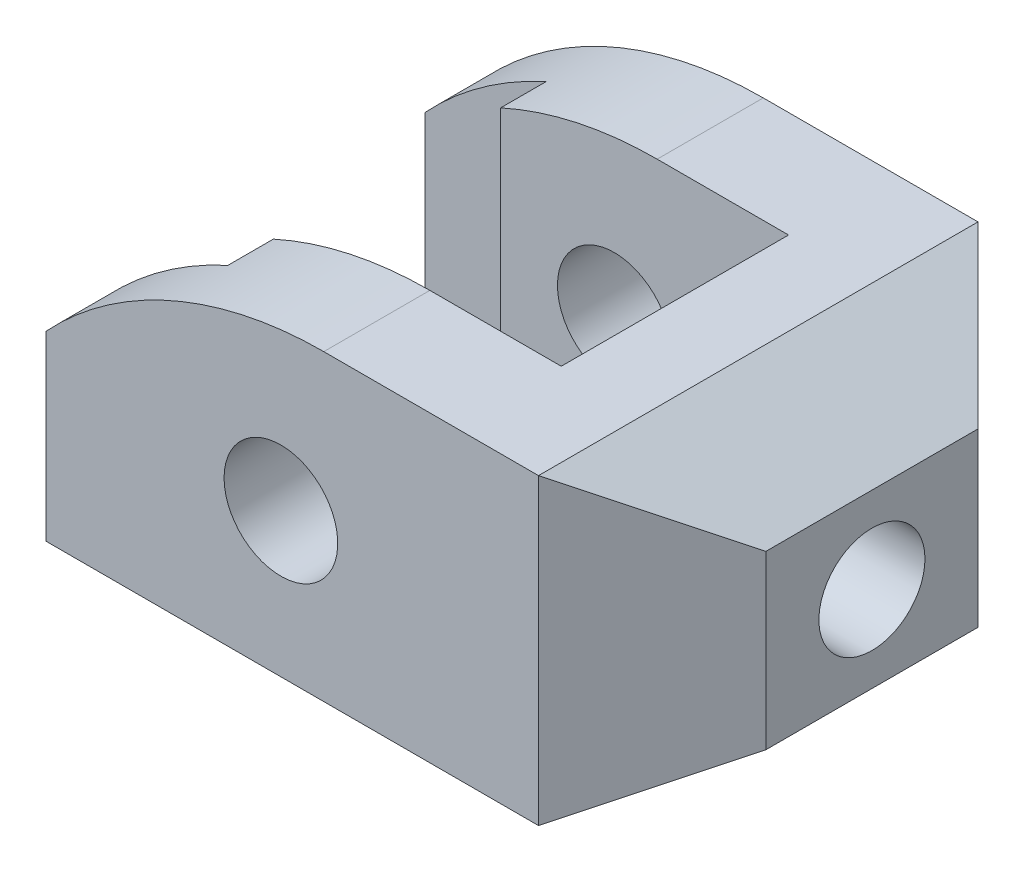
ISO-10303-21;
HEADER;
FILE_DESCRIPTION(('STEP AP214'),'2;1');
FILE_NAME('part.step','',(''),(''),'','','');
FILE_SCHEMA(('AUTOMOTIVE_DESIGN { 1 0 10303 214 1 1 1 1 }'));
ENDSEC;
DATA;
#1=APPLICATION_CONTEXT('core data for automotive mechanical design processes');
#2=APPLICATION_PROTOCOL_DEFINITION('international standard','automotive_design',2000,#1);
#3=PRODUCT_CONTEXT('',#1,'mechanical');
#4=PRODUCT('Part','Part','',(#3));
#5=PRODUCT_RELATED_PRODUCT_CATEGORY('part','',(#4));
#6=PRODUCT_DEFINITION_FORMATION('','',#4);
#7=PRODUCT_DEFINITION_CONTEXT('part definition',#1,'design');
#8=PRODUCT_DEFINITION('design','',#6,#7);
#9=PRODUCT_DEFINITION_SHAPE('','',#8);
#10=(LENGTH_UNIT() NAMED_UNIT(*) SI_UNIT(.MILLI.,.METRE.));
#11=(NAMED_UNIT(*) PLANE_ANGLE_UNIT() SI_UNIT($,.RADIAN.));
#12=(NAMED_UNIT(*) SI_UNIT($,.STERADIAN.) SOLID_ANGLE_UNIT());
#13=UNCERTAINTY_MEASURE_WITH_UNIT(LENGTH_MEASURE(1.E-05),#10,'distance_accuracy_value','');
#14=(GEOMETRIC_REPRESENTATION_CONTEXT(3) GLOBAL_UNCERTAINTY_ASSIGNED_CONTEXT((#13)) GLOBAL_UNIT_ASSIGNED_CONTEXT((#10,
#11,#12)) REPRESENTATION_CONTEXT('',''));
#15=CARTESIAN_POINT('',(0.,0.,0.));
#16=DIRECTION('',(0.,0.,1.));
#17=DIRECTION('',(1.,0.,0.));
#18=AXIS2_PLACEMENT_3D('',#15,#16,#17);
#19=CARTESIAN_POINT('',(36.6606055596467,-10.,58.));
#20=DIRECTION('',(0.,0.,-1.));
#21=DIRECTION('',(-1.,0.,0.));
#22=AXIS2_PLACEMENT_3D('',#19,#20,#21);
#23=CYLINDRICAL_SURFACE('',#22,50.);
#24=DIRECTION('',(0.,0.,-1.));
#25=VECTOR('',#24,1.);
#26=CARTESIAN_POINT('',(0.,24.,58.));
#27=LINE('',#26,#25);
#28=CARTESIAN_POINT('',(0.,24.,8.));
#29=VERTEX_POINT('',#28);
#30=CARTESIAN_POINT('',(0.,24.,0.));
#31=VERTEX_POINT('',#30);
#32=EDGE_CURVE('E226',#29,#31,#27,.T.);
#33=ORIENTED_EDGE('',*,*,#32,.F.);
#34=CARTESIAN_POINT('',(36.6606055596467,-10.,8.));
#35=DIRECTION('',(0.,0.,-1.));
#36=DIRECTION('',(-1.,0.,0.));
#37=AXIS2_PLACEMENT_3D('',#34,#35,#36);
#38=CIRCLE('',#37,50.);
#39=CARTESIAN_POINT('',(16.,35.5317403347236,8.));
#40=VERTEX_POINT('',#39);
#41=EDGE_CURVE('E356',#29,#40,#38,.T.);
#42=ORIENTED_EDGE('',*,*,#41,.T.);
#43=DIRECTION('',(0.,0.,-1.));
#44=VECTOR('',#43,1.);
#45=CARTESIAN_POINT('',(16.,35.5317403347236,58.));
#46=LINE('',#45,#44);
#47=CARTESIAN_POINT('',(16.,35.5317403347236,14.));
#48=VERTEX_POINT('',#47);
#49=EDGE_CURVE('E260',#40,#48,#46,.F.);
#50=ORIENTED_EDGE('',*,*,#49,.T.);
#51=CARTESIAN_POINT('',(36.6606055596467,-10.,14.));
#52=DIRECTION('',(0.,0.,-1.));
#53=DIRECTION('',(-1.,0.,0.));
#54=AXIS2_PLACEMENT_3D('',#51,#52,#53);
#55=CIRCLE('',#54,50.);
#56=CARTESIAN_POINT('',(36.6606055596467,40.,14.));
#57=VERTEX_POINT('',#56);
#58=EDGE_CURVE('E256',#48,#57,#55,.T.);
#59=ORIENTED_EDGE('',*,*,#58,.T.);
#60=DIRECTION('',(0.,0.,-1.));
#61=VECTOR('',#60,1.);
#62=CARTESIAN_POINT('',(36.6606055596467,40.,58.));
#63=LINE('',#62,#61);
#64=CARTESIAN_POINT('',(36.6606055596467,40.,0.));
#65=VERTEX_POINT('',#64);
#66=EDGE_CURVE('E231',#57,#65,#63,.T.);
#67=ORIENTED_EDGE('',*,*,#66,.T.);
#68=CARTESIAN_POINT('',(36.6606055596467,-10.,0.));
#69=DIRECTION('',(0.,0.,1.));
#70=DIRECTION('',(1.,0.,0.));
#71=AXIS2_PLACEMENT_3D('',#68,#69,#70);
#72=CIRCLE('',#71,50.);
#73=EDGE_CURVE('E206',#65,#31,#72,.T.);
#74=ORIENTED_EDGE('',*,*,#73,.T.);
#75=EDGE_LOOP('',(#33,#42,#50,#59,#67,#74));
#76=FACE_BOUND('',#75,.T.);
#77=ADVANCED_FACE('F43',(#76),#23,.T.);
#78=CARTESIAN_POINT('',(0.,0.,58.));
#79=DIRECTION('',(1.,0.,0.));
#80=DIRECTION('',(0.,0.,-1.));
#81=AXIS2_PLACEMENT_3D('',#78,#79,#80);
#82=PLANE('',#81);
#83=DIRECTION('',(0.,0.,-1.));
#84=VECTOR('',#83,1.);
#85=CARTESIAN_POINT('',(0.,0.,58.));
#86=LINE('',#85,#84);
#87=CARTESIAN_POINT('',(0.,0.,8.));
#88=VERTEX_POINT('',#87);
#89=CARTESIAN_POINT('',(0.,0.,0.));
#90=VERTEX_POINT('',#89);
#91=EDGE_CURVE('E199',#88,#90,#86,.T.);
#92=ORIENTED_EDGE('',*,*,#91,.F.);
#93=DIRECTION('',(0.,1.,0.));
#94=VECTOR('',#93,1.);
#95=CARTESIAN_POINT('',(0.,0.,8.));
#96=LINE('',#95,#94);
#97=EDGE_CURVE('E251',#88,#29,#96,.T.);
#98=ORIENTED_EDGE('',*,*,#97,.T.);
#99=ORIENTED_EDGE('',*,*,#32,.T.);
#100=DIRECTION('',(0.,-1.,0.));
#101=VECTOR('',#100,1.);
#102=CARTESIAN_POINT('',(0.,0.,0.));
#103=LINE('',#102,#101);
#104=EDGE_CURVE('E218',#31,#90,#103,.T.);
#105=ORIENTED_EDGE('',*,*,#104,.T.);
#106=EDGE_LOOP('',(#92,#98,#99,#105));
#107=FACE_BOUND('',#106,.T.);
#108=ADVANCED_FACE('F385',(#107),#82,.F.);
#109=CARTESIAN_POINT('',(31.,19.,58.));
#110=DIRECTION('',(0.,0.,-1.));
#111=DIRECTION('',(-1.,0.,0.));
#112=AXIS2_PLACEMENT_3D('',#109,#110,#111);
#113=CYLINDRICAL_SURFACE('',#112,7.5);
#114=CARTESIAN_POINT('',(31.,19.,14.));
#115=DIRECTION('',(0.,0.,-1.));
#116=DIRECTION('',(-1.,0.,0.));
#117=AXIS2_PLACEMENT_3D('',#114,#115,#116);
#118=CIRCLE('',#117,7.5);
#119=CARTESIAN_POINT('',(23.5,19.,14.));
#120=VERTEX_POINT('',#119);
#121=EDGE_CURVE('E252',#120,#120,#118,.T.);
#122=CARTESIAN_POINT('',(31.,19.,0.));
#123=DIRECTION('',(0.,0.,1.));
#124=DIRECTION('',(1.,0.,0.));
#125=AXIS2_PLACEMENT_3D('',#122,#123,#124);
#126=CIRCLE('',#125,7.5);
#127=CARTESIAN_POINT('',(23.5,19.,0.));
#128=VERTEX_POINT('',#127);
#129=EDGE_CURVE('E209',#128,#128,#126,.T.);
#130=CARTESIAN_POINT('',(23.5,19.,14.));
#131=CARTESIAN_POINT('',(23.5,19.,13.8541666666667));
#132=CARTESIAN_POINT('',(23.5,19.,13.7083333333333));
#133=CARTESIAN_POINT('',(23.5,19.,13.4166666666667));
#134=CARTESIAN_POINT('',(23.5,19.,13.2708333333333));
#135=CARTESIAN_POINT('',(23.5,19.,12.9791666666667));
#136=CARTESIAN_POINT('',(23.5,19.,12.8333333333333));
#137=CARTESIAN_POINT('',(23.5,19.,12.5416666666667));
#138=CARTESIAN_POINT('',(23.5,19.,12.3958333333333));
#139=CARTESIAN_POINT('',(23.5,19.,12.1041666666667));
#140=CARTESIAN_POINT('',(23.5,19.,11.9583333333333));
#141=CARTESIAN_POINT('',(23.5,19.,11.6666666666667));
#142=CARTESIAN_POINT('',(23.5,19.,11.5208333333333));
#143=CARTESIAN_POINT('',(23.5,19.,11.2291666666667));
#144=CARTESIAN_POINT('',(23.5,19.,11.0833333333333));
#145=CARTESIAN_POINT('',(23.5,19.,10.7916666666667));
#146=CARTESIAN_POINT('',(23.5,19.,10.6458333333333));
#147=CARTESIAN_POINT('',(23.5,19.,10.3541666666667));
#148=CARTESIAN_POINT('',(23.5,19.,10.2083333333333));
#149=CARTESIAN_POINT('',(23.5,19.,9.91666666666667));
#150=CARTESIAN_POINT('',(23.5,19.,9.77083333333333));
#151=CARTESIAN_POINT('',(23.5,19.,9.47916666666667));
#152=CARTESIAN_POINT('',(23.5,19.,9.33333333333333));
#153=CARTESIAN_POINT('',(23.5,19.,9.04166666666667));
#154=CARTESIAN_POINT('',(23.5,19.,8.89583333333333));
#155=CARTESIAN_POINT('',(23.5,19.,8.60416666666667));
#156=CARTESIAN_POINT('',(23.5,19.,8.45833333333333));
#157=CARTESIAN_POINT('',(23.5,19.,8.16666666666667));
#158=CARTESIAN_POINT('',(23.5,19.,8.02083333333333));
#159=CARTESIAN_POINT('',(23.5,19.,7.72916666666667));
#160=CARTESIAN_POINT('',(23.5,19.,7.58333333333333));
#161=CARTESIAN_POINT('',(23.5,19.,7.29166666666667));
#162=CARTESIAN_POINT('',(23.5,19.,7.14583333333333));
#163=CARTESIAN_POINT('',(23.5,19.,6.85416666666667));
#164=CARTESIAN_POINT('',(23.5,19.,6.70833333333333));
#165=CARTESIAN_POINT('',(23.5,19.,6.41666666666667));
#166=CARTESIAN_POINT('',(23.5,19.,6.27083333333333));
#167=CARTESIAN_POINT('',(23.5,19.,5.97916666666667));
#168=CARTESIAN_POINT('',(23.5,19.,5.83333333333333));
#169=CARTESIAN_POINT('',(23.5,19.,5.54166666666666));
#170=CARTESIAN_POINT('',(23.5,19.,5.39583333333333));
#171=CARTESIAN_POINT('',(23.5,19.,5.10416666666666));
#172=CARTESIAN_POINT('',(23.5,19.,4.95833333333333));
#173=CARTESIAN_POINT('',(23.5,19.,4.66666666666667));
#174=CARTESIAN_POINT('',(23.5,19.,4.52083333333333));
#175=CARTESIAN_POINT('',(23.5,19.,4.22916666666667));
#176=CARTESIAN_POINT('',(23.5,19.,4.08333333333333));
#177=CARTESIAN_POINT('',(23.5,19.,3.79166666666667));
#178=CARTESIAN_POINT('',(23.5,19.,3.64583333333333));
#179=CARTESIAN_POINT('',(23.5,19.,3.35416666666667));
#180=CARTESIAN_POINT('',(23.5,19.,3.20833333333333));
#181=CARTESIAN_POINT('',(23.5,19.,2.91666666666666));
#182=CARTESIAN_POINT('',(23.5,19.,2.77083333333333));
#183=CARTESIAN_POINT('',(23.5,19.,2.47916666666667));
#184=CARTESIAN_POINT('',(23.5,19.,2.33333333333334));
#185=CARTESIAN_POINT('',(23.5,19.,2.04166666666667));
#186=CARTESIAN_POINT('',(23.5,19.,1.89583333333333));
#187=CARTESIAN_POINT('',(23.5,19.,1.60416666666667));
#188=CARTESIAN_POINT('',(23.5,19.,1.45833333333333));
#189=CARTESIAN_POINT('',(23.5,19.,1.16666666666667));
#190=CARTESIAN_POINT('',(23.5,19.,1.02083333333333));
#191=CARTESIAN_POINT('',(23.5,19.,0.729166666666667));
#192=CARTESIAN_POINT('',(23.5,19.,0.583333333333334));
#193=CARTESIAN_POINT('',(23.5,19.,0.291666666666667));
#194=CARTESIAN_POINT('',(23.5,19.,0.145833333333333));
#195=CARTESIAN_POINT('',(23.5,19.,0.));
#196=B_SPLINE_CURVE_WITH_KNOTS('',3,(#130,#131,#132,#133,#134,#135,#136,#137,#138,#139,#140,
#141,#142,#143,#144,#145,#146,#147,#148,#149,#150,#151,#152,#153,#154,#155,#156,#157,#158,#159,
#160,#161,#162,#163,#164,#165,#166,#167,#168,#169,#170,#171,#172,#173,#174,#175,#176,#177,#178,
#179,#180,#181,#182,#183,#184,#185,#186,#187,#188,#189,#190,#191,#192,#193,#194,#195),
.UNSPECIFIED.,.F.,.F.,(4,2,2,2,2,2,2,2,2,2,2,2,2,2,2,2,2,2,2,2,2,2,2,2,2,2,2,2,2,2,2,2,4),(0.,
0.4375,0.875000000000001,1.3125,1.75,2.1875,2.625,3.0625,3.5,3.9375,4.375,4.8125,5.25,5.6875,
6.125,6.5625,7.,7.4375,7.875,8.3125,8.75,9.1875,9.62499999999999,10.0625,10.5,10.9375,11.375,
11.8125,12.25,12.6875,13.125,13.5625,14.),.UNSPECIFIED.);
#197=EDGE_CURVE('BSEAM425',#120,#128,#196,.T.);
#198=ORIENTED_EDGE('',*,*,#121,.F.);
#199=ORIENTED_EDGE('',*,*,#129,.F.);
#200=ORIENTED_EDGE('',*,*,#197,.T.);
#201=ORIENTED_EDGE('',*,*,#197,.F.);
#202=EDGE_LOOP('',(#198,#200,#199,#201));
#203=FACE_BOUND('',#202,.T.);
#204=ADVANCED_FACE('F425',(#203),#113,.F.);
#205=CARTESIAN_POINT('',(36.6606055596467,-10.,58.));
#206=DIRECTION('',(0.,0.,1.));
#207=DIRECTION('',(1.,0.,0.));
#208=AXIS2_PLACEMENT_3D('',#205,#206,#207);
#209=PLANE('',#208);
#210=DIRECTION('',(0.,1.,0.));
#211=VECTOR('',#210,1.);
#212=CARTESIAN_POINT('',(65.,0.,58.));
#213=LINE('',#212,#211);
#214=CARTESIAN_POINT('',(65.,0.,58.));
#215=VERTEX_POINT('',#214);
#216=CARTESIAN_POINT('',(65.,40.,58.));
#217=VERTEX_POINT('',#216);
#218=EDGE_CURVE('E183',#215,#217,#213,.T.);
#219=ORIENTED_EDGE('',*,*,#218,.T.);
#220=DIRECTION('',(-1.,0.,0.));
#221=VECTOR('',#220,1.);
#222=CARTESIAN_POINT('',(65.,40.,58.));
#223=LINE('',#222,#221);
#224=CARTESIAN_POINT('',(36.6606055596467,40.,58.));
#225=VERTEX_POINT('',#224);
#226=EDGE_CURVE('E365',#217,#225,#223,.T.);
#227=ORIENTED_EDGE('',*,*,#226,.T.);
#228=CARTESIAN_POINT('',(36.6606055596467,-10.,58.));
#229=DIRECTION('',(0.,0.,1.));
#230=DIRECTION('',(1.,0.,0.));
#231=AXIS2_PLACEMENT_3D('',#228,#229,#230);
#232=CIRCLE('',#231,50.);
#233=CARTESIAN_POINT('',(0.,24.,58.));
#234=VERTEX_POINT('',#233);
#235=EDGE_CURVE('E367',#225,#234,#232,.T.);
#236=ORIENTED_EDGE('',*,*,#235,.T.);
#237=DIRECTION('',(0.,-1.,0.));
#238=VECTOR('',#237,1.);
#239=CARTESIAN_POINT('',(0.,0.,58.));
#240=LINE('',#239,#238);
#241=CARTESIAN_POINT('',(0.,0.,58.));
#242=VERTEX_POINT('',#241);
#243=EDGE_CURVE('E212',#234,#242,#240,.T.);
#244=ORIENTED_EDGE('',*,*,#243,.T.);
#245=DIRECTION('',(1.,0.,0.));
#246=VECTOR('',#245,1.);
#247=CARTESIAN_POINT('',(0.,0.,58.));
#248=LINE('',#247,#246);
#249=EDGE_CURVE('E221',#242,#215,#248,.T.);
#250=ORIENTED_EDGE('',*,*,#249,.T.);
#251=EDGE_LOOP('',(#219,#227,#236,#244,#250));
#252=FACE_BOUND('',#251,.T.);
#253=CARTESIAN_POINT('',(31.,19.,58.));
#254=DIRECTION('',(0.,0.,1.));
#255=DIRECTION('',(1.,0.,0.));
#256=AXIS2_PLACEMENT_3D('',#253,#254,#255);
#257=CIRCLE('',#256,7.5);
#258=CARTESIAN_POINT('',(23.5,19.,58.));
#259=VERTEX_POINT('',#258);
#260=EDGE_CURVE('E202',#259,#259,#257,.T.);
#261=ORIENTED_EDGE('',*,*,#260,.F.);
#262=EDGE_LOOP('',(#261));
#263=FACE_BOUND('',#262,.T.);
#264=ADVANCED_FACE('F406',(#252,#263),#209,.T.);
#265=CARTESIAN_POINT('',(36.6606055596467,-10.,0.));
#266=DIRECTION('',(0.,0.,1.));
#267=DIRECTION('',(1.,0.,0.));
#268=AXIS2_PLACEMENT_3D('',#265,#266,#267);
#269=PLANE('',#268);
#270=DIRECTION('',(-1.,0.,0.));
#271=VECTOR('',#270,1.);
#272=CARTESIAN_POINT('',(65.,40.,0.));
#273=LINE('',#272,#271);
#274=CARTESIAN_POINT('',(65.,40.,0.));
#275=VERTEX_POINT('',#274);
#276=EDGE_CURVE('E181',#275,#65,#273,.T.);
#277=ORIENTED_EDGE('',*,*,#276,.F.);
#278=DIRECTION('',(0.,1.,0.));
#279=VECTOR('',#278,1.);
#280=CARTESIAN_POINT('',(65.,0.,0.));
#281=LINE('',#280,#279);
#282=CARTESIAN_POINT('',(65.,0.,0.));
#283=VERTEX_POINT('',#282);
#284=EDGE_CURVE('E160',#283,#275,#281,.T.);
#285=ORIENTED_EDGE('',*,*,#284,.F.);
#286=DIRECTION('',(1.,0.,0.));
#287=VECTOR('',#286,1.);
#288=CARTESIAN_POINT('',(0.,0.,0.));
#289=LINE('',#288,#287);
#290=EDGE_CURVE('E178',#90,#283,#289,.T.);
#291=ORIENTED_EDGE('',*,*,#290,.F.);
#292=ORIENTED_EDGE('',*,*,#104,.F.);
#293=ORIENTED_EDGE('',*,*,#73,.F.);
#294=EDGE_LOOP('',(#277,#285,#291,#292,#293));
#295=FACE_BOUND('',#294,.T.);
#296=ORIENTED_EDGE('',*,*,#129,.T.);
#297=EDGE_LOOP('',(#296));
#298=FACE_BOUND('',#297,.T.);
#299=ADVANCED_FACE('F174',(#295,#298),#269,.F.);
#300=CARTESIAN_POINT('',(0.,0.,58.));
#301=DIRECTION('',(0.,1.,0.));
#302=DIRECTION('',(0.,0.,1.));
#303=AXIS2_PLACEMENT_3D('',#300,#301,#302);
#304=PLANE('',#303);
#305=DIRECTION('',(0.,0.,-1.));
#306=VECTOR('',#305,1.);
#307=CARTESIAN_POINT('',(16.,0.,8.));
#308=LINE('',#307,#306);
#309=CARTESIAN_POINT('',(16.,0.,14.));
#310=VERTEX_POINT('',#309);
#311=CARTESIAN_POINT('',(16.,0.,8.));
#312=VERTEX_POINT('',#311);
#313=EDGE_CURVE('E303',#310,#312,#308,.T.);
#314=ORIENTED_EDGE('',*,*,#313,.T.);
#315=DIRECTION('',(-1.,0.,0.));
#316=VECTOR('',#315,1.);
#317=CARTESIAN_POINT('',(0.,0.,8.));
#318=LINE('',#317,#316);
#319=EDGE_CURVE('E306',#312,#88,#318,.T.);
#320=ORIENTED_EDGE('',*,*,#319,.T.);
#321=ORIENTED_EDGE('',*,*,#91,.T.);
#322=ORIENTED_EDGE('',*,*,#290,.T.);
#323=DIRECTION('',(0.,0.,-1.));
#324=VECTOR('',#323,1.);
#325=CARTESIAN_POINT('',(65.,0.,58.));
#326=LINE('',#325,#324);
#327=EDGE_CURVE('E187',#215,#283,#326,.T.);
#328=ORIENTED_EDGE('',*,*,#327,.F.);
#329=ORIENTED_EDGE('',*,*,#249,.F.);
#330=CARTESIAN_POINT('',(0.,0.,50.));
#331=VERTEX_POINT('',#330);
#332=EDGE_CURVE('E222',#242,#331,#86,.T.);
#333=ORIENTED_EDGE('',*,*,#332,.T.);
#334=DIRECTION('',(1.,0.,0.));
#335=VECTOR('',#334,1.);
#336=CARTESIAN_POINT('',(0.,0.,50.));
#337=LINE('',#336,#335);
#338=CARTESIAN_POINT('',(16.,0.,50.));
#339=VERTEX_POINT('',#338);
#340=EDGE_CURVE('E68',#331,#339,#337,.T.);
#341=ORIENTED_EDGE('',*,*,#340,.T.);
#342=DIRECTION('',(0.,0.,-1.));
#343=VECTOR('',#342,1.);
#344=CARTESIAN_POINT('',(16.,0.,44.));
#345=LINE('',#344,#343);
#346=CARTESIAN_POINT('',(16.,0.,44.));
#347=VERTEX_POINT('',#346);
#348=EDGE_CURVE('E286',#339,#347,#345,.T.);
#349=ORIENTED_EDGE('',*,*,#348,.T.);
#350=DIRECTION('',(1.,0.,0.));
#351=VECTOR('',#350,1.);
#352=CARTESIAN_POINT('',(16.,0.,44.));
#353=LINE('',#352,#351);
#354=CARTESIAN_POINT('',(54.,0.,44.));
#355=VERTEX_POINT('',#354);
#356=EDGE_CURVE('E291',#347,#355,#353,.T.);
#357=ORIENTED_EDGE('',*,*,#356,.T.);
#358=DIRECTION('',(0.,0.,-1.));
#359=VECTOR('',#358,1.);
#360=CARTESIAN_POINT('',(54.,0.,14.));
#361=LINE('',#360,#359);
#362=CARTESIAN_POINT('',(54.,0.,14.));
#363=VERTEX_POINT('',#362);
#364=EDGE_CURVE('E295',#355,#363,#361,.T.);
#365=ORIENTED_EDGE('',*,*,#364,.T.);
#366=DIRECTION('',(-1.,0.,0.));
#367=VECTOR('',#366,1.);
#368=CARTESIAN_POINT('',(16.,0.,14.));
#369=LINE('',#368,#367);
#370=EDGE_CURVE('E299',#363,#310,#369,.T.);
#371=ORIENTED_EDGE('',*,*,#370,.T.);
#372=EDGE_LOOP('',(#314,#320,#321,#322,#328,#329,#333,#341,#349,#357,#365,#371));
#373=FACE_BOUND('',#372,.T.);
#374=ADVANCED_FACE('F45',(#373),#304,.F.);
#375=CARTESIAN_POINT('',(65.,0.,58.));
#376=DIRECTION('',(-0.500000000000001,0.866025403784438,0.));
#377=DIRECTION('',(-0.866025403784438,-0.500000000000001,0.));
#378=AXIS2_PLACEMENT_3D('',#375,#376,#377);
#379=PLANE('',#378);
#380=ORIENTED_EDGE('',*,*,#327,.T.);
#381=DIRECTION('',(0.65465367070798,0.37796447300923,0.654653670707973));
#382=VECTOR('',#381,1.);
#383=CARTESIAN_POINT('',(89.8571428571428,14.3512781198564,24.8571428571425));
#384=LINE('',#383,#382);
#385=CARTESIAN_POINT('',(80.,8.66025403784441,14.9999999999998));
#386=VERTEX_POINT('',#385);
#387=EDGE_CURVE('E157',#283,#386,#384,.T.);
#388=ORIENTED_EDGE('',*,*,#387,.T.);
#389=DIRECTION('',(0.,0.,-1.));
#390=VECTOR('',#389,1.);
#391=CARTESIAN_POINT('',(80.,8.66025403784441,58.));
#392=LINE('',#391,#390);
#393=CARTESIAN_POINT('',(80.,8.66025403784441,43.0000000000002));
#394=VERTEX_POINT('',#393);
#395=EDGE_CURVE('E194',#394,#386,#392,.T.);
#396=ORIENTED_EDGE('',*,*,#395,.F.);
#397=DIRECTION('',(-0.65465367070798,-0.37796447300923,0.654653670707973));
#398=VECTOR('',#397,1.);
#399=CARTESIAN_POINT('',(65.,0.,58.));
#400=LINE('',#399,#398);
#401=EDGE_CURVE('E169',#394,#215,#400,.T.);
#402=ORIENTED_EDGE('',*,*,#401,.T.);
#403=EDGE_LOOP('',(#380,#388,#396,#402));
#404=FACE_BOUND('',#403,.T.);
#405=ADVANCED_FACE('F188',(#404),#379,.F.);
#406=CARTESIAN_POINT('',(80.,8.66025403784441,58.));
#407=DIRECTION('',(-1.,0.,0.));
#408=DIRECTION('',(0.,0.,1.));
#409=AXIS2_PLACEMENT_3D('',#406,#407,#408);
#410=PLANE('',#409);
#411=CARTESIAN_POINT('',(80.,20.,29.));
#412=DIRECTION('',(1.,0.,0.));
#413=DIRECTION('',(0.,0.,-1.));
#414=AXIS2_PLACEMENT_3D('',#411,#412,#413);
#415=CIRCLE('',#414,7.);
#416=CARTESIAN_POINT('',(80.,20.,22.));
#417=VERTEX_POINT('',#416);
#418=EDGE_CURVE('E278',#417,#417,#415,.T.);
#419=ORIENTED_EDGE('',*,*,#418,.F.);
#420=EDGE_LOOP('',(#419));
#421=FACE_BOUND('',#420,.T.);
#422=ORIENTED_EDGE('',*,*,#395,.T.);
#423=DIRECTION('',(0.,1.,0.));
#424=VECTOR('',#423,1.);
#425=CARTESIAN_POINT('',(80.,0.,14.9999999999998));
#426=LINE('',#425,#424);
#427=CARTESIAN_POINT('',(80.,31.3397459621556,14.9999999999998));
#428=VERTEX_POINT('',#427);
#429=EDGE_CURVE('E162',#386,#428,#426,.T.);
#430=ORIENTED_EDGE('',*,*,#429,.T.);
#431=DIRECTION('',(0.,0.,-1.));
#432=VECTOR('',#431,1.);
#433=CARTESIAN_POINT('',(80.,31.3397459621556,58.));
#434=LINE('',#433,#432);
#435=CARTESIAN_POINT('',(80.,31.3397459621556,43.0000000000002));
#436=VERTEX_POINT('',#435);
#437=EDGE_CURVE('E240',#436,#428,#434,.T.);
#438=ORIENTED_EDGE('',*,*,#437,.F.);
#439=DIRECTION('',(0.,1.,0.));
#440=VECTOR('',#439,1.);
#441=CARTESIAN_POINT('',(80.,0.,43.0000000000002));
#442=LINE('',#441,#440);
#443=EDGE_CURVE('E60',#394,#436,#442,.T.);
#444=ORIENTED_EDGE('',*,*,#443,.F.);
#445=EDGE_LOOP('',(#422,#430,#438,#444));
#446=FACE_BOUND('',#445,.T.);
#447=ADVANCED_FACE('F272',(#421,#446),#410,.F.);
#448=CARTESIAN_POINT('',(80.,31.3397459621556,58.));
#449=DIRECTION('',(-0.500000000000001,-0.866025403784438,0.));
#450=DIRECTION('',(0.866025403784438,-0.500000000000001,0.));
#451=AXIS2_PLACEMENT_3D('',#448,#449,#450);
#452=PLANE('',#451);
#453=ORIENTED_EDGE('',*,*,#437,.T.);
#454=DIRECTION('',(-0.65465367070798,0.37796447300923,-0.654653670707973));
#455=VECTOR('',#454,1.);
#456=CARTESIAN_POINT('',(98.4285714285715,20.7000052870896,33.4285714285711));
#457=LINE('',#456,#455);
#458=EDGE_CURVE('E11',#428,#275,#457,.T.);
#459=ORIENTED_EDGE('',*,*,#458,.T.);
#460=DIRECTION('',(0.,0.,-1.));
#461=VECTOR('',#460,1.);
#462=CARTESIAN_POINT('',(65.,40.,58.));
#463=LINE('',#462,#461);
#464=EDGE_CURVE('E236',#217,#275,#463,.T.);
#465=ORIENTED_EDGE('',*,*,#464,.F.);
#466=DIRECTION('',(0.65465367070798,-0.37796447300923,-0.654653670707973));
#467=VECTOR('',#466,1.);
#468=CARTESIAN_POINT('',(73.5714285714287,35.051283406946,49.4285714285714));
#469=LINE('',#468,#467);
#470=EDGE_CURVE('E53',#217,#436,#469,.T.);
#471=ORIENTED_EDGE('',*,*,#470,.T.);
#472=EDGE_LOOP('',(#453,#459,#465,#471));
#473=FACE_BOUND('',#472,.T.);
#474=ADVANCED_FACE('F268',(#473),#452,.F.);
#475=CARTESIAN_POINT('',(65.,40.,58.));
#476=DIRECTION('',(0.,-1.,0.));
#477=DIRECTION('',(1.,0.,0.));
#478=AXIS2_PLACEMENT_3D('',#475,#476,#477);
#479=PLANE('',#478);
#480=ORIENTED_EDGE('',*,*,#66,.F.);
#481=DIRECTION('',(-1.,0.,0.));
#482=VECTOR('',#481,1.);
#483=CARTESIAN_POINT('',(16.,40.,14.));
#484=LINE('',#483,#482);
#485=CARTESIAN_POINT('',(54.,40.,14.));
#486=VERTEX_POINT('',#485);
#487=EDGE_CURVE('E287',#486,#57,#484,.T.);
#488=ORIENTED_EDGE('',*,*,#487,.F.);
#489=DIRECTION('',(0.,0.,-1.));
#490=VECTOR('',#489,1.);
#491=CARTESIAN_POINT('',(54.,40.,14.));
#492=LINE('',#491,#490);
#493=CARTESIAN_POINT('',(54.,40.,44.));
#494=VERTEX_POINT('',#493);
#495=EDGE_CURVE('E312',#494,#486,#492,.T.);
#496=ORIENTED_EDGE('',*,*,#495,.F.);
#497=DIRECTION('',(1.,0.,0.));
#498=VECTOR('',#497,1.);
#499=CARTESIAN_POINT('',(16.,40.,44.));
#500=LINE('',#499,#498);
#501=CARTESIAN_POINT('',(36.6606055596467,40.,44.));
#502=VERTEX_POINT('',#501);
#503=EDGE_CURVE('E168',#502,#494,#500,.T.);
#504=ORIENTED_EDGE('',*,*,#503,.F.);
#505=EDGE_CURVE('E232',#225,#502,#63,.T.);
#506=ORIENTED_EDGE('',*,*,#505,.F.);
#507=ORIENTED_EDGE('',*,*,#226,.F.);
#508=ORIENTED_EDGE('',*,*,#464,.T.);
#509=ORIENTED_EDGE('',*,*,#276,.T.);
#510=EDGE_LOOP('',(#480,#488,#496,#504,#506,#507,#508,#509));
#511=FACE_BOUND('',#510,.T.);
#512=ADVANCED_FACE('F383',(#511),#479,.F.);
#513=ORIENTED_EDGE('',*,*,#505,.T.);
#514=CARTESIAN_POINT('',(36.6606055596467,-10.,44.));
#515=DIRECTION('',(0.,0.,1.));
#516=DIRECTION('',(1.,0.,0.));
#517=AXIS2_PLACEMENT_3D('',#514,#515,#516);
#518=CIRCLE('',#517,50.);
#519=CARTESIAN_POINT('',(16.,35.5317403347236,44.));
#520=VERTEX_POINT('',#519);
#521=EDGE_CURVE('E250',#502,#520,#518,.T.);
#522=ORIENTED_EDGE('',*,*,#521,.T.);
#523=DIRECTION('',(0.,0.,-1.));
#524=VECTOR('',#523,1.);
#525=CARTESIAN_POINT('',(16.,35.5317403347236,58.));
#526=LINE('',#525,#524);
#527=CARTESIAN_POINT('',(16.,35.5317403347236,50.));
#528=VERTEX_POINT('',#527);
#529=EDGE_CURVE('E193',#520,#528,#526,.F.);
#530=ORIENTED_EDGE('',*,*,#529,.T.);
#531=CARTESIAN_POINT('',(36.6606055596467,-10.,50.));
#532=DIRECTION('',(0.,0.,1.));
#533=DIRECTION('',(1.,0.,0.));
#534=AXIS2_PLACEMENT_3D('',#531,#532,#533);
#535=CIRCLE('',#534,50.);
#536=CARTESIAN_POINT('',(0.,24.,50.));
#537=VERTEX_POINT('',#536);
#538=EDGE_CURVE('E352',#528,#537,#535,.T.);
#539=ORIENTED_EDGE('',*,*,#538,.T.);
#540=EDGE_CURVE('E227',#234,#537,#27,.T.);
#541=ORIENTED_EDGE('',*,*,#540,.F.);
#542=ORIENTED_EDGE('',*,*,#235,.F.);
#543=EDGE_LOOP('',(#513,#522,#530,#539,#541,#542));
#544=FACE_BOUND('',#543,.T.);
#545=ADVANCED_FACE('F405',(#544),#23,.T.);
#546=ORIENTED_EDGE('',*,*,#540,.T.);
#547=DIRECTION('',(0.,1.,0.));
#548=VECTOR('',#547,1.);
#549=CARTESIAN_POINT('',(0.,0.,50.));
#550=LINE('',#549,#548);
#551=EDGE_CURVE('E309',#331,#537,#550,.T.);
#552=ORIENTED_EDGE('',*,*,#551,.F.);
#553=ORIENTED_EDGE('',*,*,#332,.F.);
#554=ORIENTED_EDGE('',*,*,#243,.F.);
#555=EDGE_LOOP('',(#546,#552,#553,#554));
#556=FACE_BOUND('',#555,.T.);
#557=ADVANCED_FACE('F427',(#556),#82,.F.);
#558=CARTESIAN_POINT('',(31.,19.,44.));
#559=DIRECTION('',(0.,0.,1.));
#560=DIRECTION('',(1.,0.,0.));
#561=AXIS2_PLACEMENT_3D('',#558,#559,#560);
#562=CIRCLE('',#561,7.5);
#563=CARTESIAN_POINT('',(23.5,19.,44.));
#564=VERTEX_POINT('',#563);
#565=EDGE_CURVE('E246',#564,#564,#562,.T.);
#566=CARTESIAN_POINT('',(23.5,19.,44.));
#567=CARTESIAN_POINT('',(23.5,19.,44.1458333333333));
#568=CARTESIAN_POINT('',(23.5,19.,44.2916666666667));
#569=CARTESIAN_POINT('',(23.5,19.,44.5833333333333));
#570=CARTESIAN_POINT('',(23.5,19.,44.7291666666667));
#571=CARTESIAN_POINT('',(23.5,19.,45.0208333333333));
#572=CARTESIAN_POINT('',(23.5,19.,45.1666666666667));
#573=CARTESIAN_POINT('',(23.5,19.,45.4583333333333));
#574=CARTESIAN_POINT('',(23.5,19.,45.6041666666667));
#575=CARTESIAN_POINT('',(23.5,19.,45.8958333333333));
#576=CARTESIAN_POINT('',(23.5,19.,46.0416666666667));
#577=CARTESIAN_POINT('',(23.5,19.,46.3333333333333));
#578=CARTESIAN_POINT('',(23.5,19.,46.4791666666667));
#579=CARTESIAN_POINT('',(23.5,19.,46.7708333333333));
#580=CARTESIAN_POINT('',(23.5,19.,46.9166666666667));
#581=CARTESIAN_POINT('',(23.5,19.,47.2083333333333));
#582=CARTESIAN_POINT('',(23.5,19.,47.3541666666667));
#583=CARTESIAN_POINT('',(23.5,19.,47.6458333333333));
#584=CARTESIAN_POINT('',(23.5,19.,47.7916666666667));
#585=CARTESIAN_POINT('',(23.5,19.,48.0833333333333));
#586=CARTESIAN_POINT('',(23.5,19.,48.2291666666667));
#587=CARTESIAN_POINT('',(23.5,19.,48.5208333333333));
#588=CARTESIAN_POINT('',(23.5,19.,48.6666666666667));
#589=CARTESIAN_POINT('',(23.5,19.,48.9583333333333));
#590=CARTESIAN_POINT('',(23.5,19.,49.1041666666667));
#591=CARTESIAN_POINT('',(23.5,19.,49.3958333333333));
#592=CARTESIAN_POINT('',(23.5,19.,49.5416666666667));
#593=CARTESIAN_POINT('',(23.5,19.,49.8333333333333));
#594=CARTESIAN_POINT('',(23.5,19.,49.9791666666667));
#595=CARTESIAN_POINT('',(23.5,19.,50.2708333333333));
#596=CARTESIAN_POINT('',(23.5,19.,50.4166666666667));
#597=CARTESIAN_POINT('',(23.5,19.,50.7083333333333));
#598=CARTESIAN_POINT('',(23.5,19.,50.8541666666667));
#599=CARTESIAN_POINT('',(23.5,19.,51.1458333333333));
#600=CARTESIAN_POINT('',(23.5,19.,51.2916666666667));
#601=CARTESIAN_POINT('',(23.5,19.,51.5833333333333));
#602=CARTESIAN_POINT('',(23.5,19.,51.7291666666667));
#603=CARTESIAN_POINT('',(23.5,19.,52.0208333333333));
#604=CARTESIAN_POINT('',(23.5,19.,52.1666666666667));
#605=CARTESIAN_POINT('',(23.5,19.,52.4583333333333));
#606=CARTESIAN_POINT('',(23.5,19.,52.6041666666667));
#607=CARTESIAN_POINT('',(23.5,19.,52.8958333333333));
#608=CARTESIAN_POINT('',(23.5,19.,53.0416666666667));
#609=CARTESIAN_POINT('',(23.5,19.,53.3333333333333));
#610=CARTESIAN_POINT('',(23.5,19.,53.4791666666667));
#611=CARTESIAN_POINT('',(23.5,19.,53.7708333333333));
#612=CARTESIAN_POINT('',(23.5,19.,53.9166666666667));
#613=CARTESIAN_POINT('',(23.5,19.,54.2083333333333));
#614=CARTESIAN_POINT('',(23.5,19.,54.3541666666667));
#615=CARTESIAN_POINT('',(23.5,19.,54.6458333333333));
#616=CARTESIAN_POINT('',(23.5,19.,54.7916666666667));
#617=CARTESIAN_POINT('',(23.5,19.,55.0833333333333));
#618=CARTESIAN_POINT('',(23.5,19.,55.2291666666667));
#619=CARTESIAN_POINT('',(23.5,19.,55.5208333333333));
#620=CARTESIAN_POINT('',(23.5,19.,55.6666666666667));
#621=CARTESIAN_POINT('',(23.5,19.,55.9583333333333));
#622=CARTESIAN_POINT('',(23.5,19.,56.1041666666667));
#623=CARTESIAN_POINT('',(23.5,19.,56.3958333333333));
#624=CARTESIAN_POINT('',(23.5,19.,56.5416666666667));
#625=CARTESIAN_POINT('',(23.5,19.,56.8333333333333));
#626=CARTESIAN_POINT('',(23.5,19.,56.9791666666667));
#627=CARTESIAN_POINT('',(23.5,19.,57.2708333333333));
#628=CARTESIAN_POINT('',(23.5,19.,57.4166666666667));
#629=CARTESIAN_POINT('',(23.5,19.,57.7083333333333));
#630=CARTESIAN_POINT('',(23.5,19.,57.8541666666667));
#631=CARTESIAN_POINT('',(23.5,19.,58.));
#632=B_SPLINE_CURVE_WITH_KNOTS('',3,(#566,#567,#568,#569,#570,#571,#572,#573,#574,#575,#576,
#577,#578,#579,#580,#581,#582,#583,#584,#585,#586,#587,#588,#589,#590,#591,#592,#593,#594,#595,
#596,#597,#598,#599,#600,#601,#602,#603,#604,#605,#606,#607,#608,#609,#610,#611,#612,#613,#614,
#615,#616,#617,#618,#619,#620,#621,#622,#623,#624,#625,#626,#627,#628,#629,#630,#631),
.UNSPECIFIED.,.F.,.F.,(4,2,2,2,2,2,2,2,2,2,2,2,2,2,2,2,2,2,2,2,2,2,2,2,2,2,2,2,2,2,2,2,4),(0.,
0.4375,0.875000000000001,1.3125,1.74999999999999,2.1875,2.625,3.0625,3.5,3.9375,4.375,4.8125,
5.25,5.6875,6.125,6.5625,7.,7.4375,7.875,8.31249999999999,8.74999999999999,9.18749999999999,
9.62499999999999,10.0625,10.5,10.9375,11.375,11.8125,12.25,12.6875,13.125,13.5625,14.),.UNSPECIFIED.);
#633=EDGE_CURVE('BSEAM434',#564,#259,#632,.T.);
#634=ORIENTED_EDGE('',*,*,#565,.F.);
#635=ORIENTED_EDGE('',*,*,#260,.T.);
#636=ORIENTED_EDGE('',*,*,#633,.T.);
#637=ORIENTED_EDGE('',*,*,#633,.F.);
#638=EDGE_LOOP('',(#634,#636,#635,#637));
#639=FACE_BOUND('',#638,.T.);
#640=ADVANCED_FACE('F434',(#639),#113,.F.);
#641=CARTESIAN_POINT('',(16.,0.,8.));
#642=DIRECTION('',(1.,0.,0.));
#643=DIRECTION('',(0.,1.,0.));
#644=AXIS2_PLACEMENT_3D('',#641,#642,#643);
#645=PLANE('',#644);
#646=DIRECTION('',(0.,1.,0.));
#647=VECTOR('',#646,1.);
#648=CARTESIAN_POINT('',(16.,0.,8.));
#649=LINE('',#648,#647);
#650=EDGE_CURVE('E321',#312,#40,#649,.T.);
#651=ORIENTED_EDGE('',*,*,#650,.F.);
#652=ORIENTED_EDGE('',*,*,#313,.F.);
#653=DIRECTION('',(0.,1.,0.));
#654=VECTOR('',#653,1.);
#655=CARTESIAN_POINT('',(16.,0.,14.));
#656=LINE('',#655,#654);
#657=EDGE_CURVE('E325',#310,#48,#656,.T.);
#658=ORIENTED_EDGE('',*,*,#657,.T.);
#659=ORIENTED_EDGE('',*,*,#49,.F.);
#660=EDGE_LOOP('',(#651,#652,#658,#659));
#661=FACE_BOUND('',#660,.T.);
#662=ADVANCED_FACE('F391',(#661),#645,.F.);
#663=CARTESIAN_POINT('',(16.,0.,44.));
#664=DIRECTION('',(1.,0.,0.));
#665=DIRECTION('',(0.,1.,0.));
#666=AXIS2_PLACEMENT_3D('',#663,#664,#665);
#667=PLANE('',#666);
#668=DIRECTION('',(0.,1.,0.));
#669=VECTOR('',#668,1.);
#670=CARTESIAN_POINT('',(16.,0.,44.));
#671=LINE('',#670,#669);
#672=EDGE_CURVE('E336',#347,#520,#671,.T.);
#673=ORIENTED_EDGE('',*,*,#672,.F.);
#674=ORIENTED_EDGE('',*,*,#348,.F.);
#675=DIRECTION('',(0.,1.,0.));
#676=VECTOR('',#675,1.);
#677=CARTESIAN_POINT('',(16.,0.,50.));
#678=LINE('',#677,#676);
#679=EDGE_CURVE('E340',#339,#528,#678,.T.);
#680=ORIENTED_EDGE('',*,*,#679,.T.);
#681=ORIENTED_EDGE('',*,*,#529,.F.);
#682=EDGE_LOOP('',(#673,#674,#680,#681));
#683=FACE_BOUND('',#682,.T.);
#684=ADVANCED_FACE('F462',(#683),#667,.F.);
#685=CARTESIAN_POINT('',(0.,0.,8.));
#686=DIRECTION('',(0.,0.,-1.));
#687=DIRECTION('',(-1.,0.,0.));
#688=AXIS2_PLACEMENT_3D('',#685,#686,#687);
#689=PLANE('',#688);
#690=ORIENTED_EDGE('',*,*,#97,.F.);
#691=ORIENTED_EDGE('',*,*,#319,.F.);
#692=ORIENTED_EDGE('',*,*,#650,.T.);
#693=ORIENTED_EDGE('',*,*,#41,.F.);
#694=EDGE_LOOP('',(#690,#691,#692,#693));
#695=FACE_BOUND('',#694,.T.);
#696=ADVANCED_FACE('F387',(#695),#689,.F.);
#697=CARTESIAN_POINT('',(0.,0.,50.));
#698=DIRECTION('',(0.,0.,1.));
#699=DIRECTION('',(1.,0.,0.));
#700=AXIS2_PLACEMENT_3D('',#697,#698,#699);
#701=PLANE('',#700);
#702=ORIENTED_EDGE('',*,*,#679,.F.);
#703=ORIENTED_EDGE('',*,*,#340,.F.);
#704=ORIENTED_EDGE('',*,*,#551,.T.);
#705=ORIENTED_EDGE('',*,*,#538,.F.);
#706=EDGE_LOOP('',(#702,#703,#704,#705));
#707=FACE_BOUND('',#706,.T.);
#708=ADVANCED_FACE('F459',(#707),#701,.F.);
#709=CARTESIAN_POINT('',(16.,0.,14.));
#710=DIRECTION('',(0.,0.,-1.));
#711=DIRECTION('',(-1.,0.,0.));
#712=AXIS2_PLACEMENT_3D('',#709,#710,#711);
#713=PLANE('',#712);
#714=ORIENTED_EDGE('',*,*,#121,.T.);
#715=EDGE_LOOP('',(#714));
#716=FACE_BOUND('',#715,.T.);
#717=ORIENTED_EDGE('',*,*,#657,.F.);
#718=ORIENTED_EDGE('',*,*,#370,.F.);
#719=DIRECTION('',(0.,1.,0.));
#720=VECTOR('',#719,1.);
#721=CARTESIAN_POINT('',(54.,0.,14.));
#722=LINE('',#721,#720);
#723=EDGE_CURVE('E329',#363,#486,#722,.T.);
#724=ORIENTED_EDGE('',*,*,#723,.T.);
#725=ORIENTED_EDGE('',*,*,#487,.T.);
#726=ORIENTED_EDGE('',*,*,#58,.F.);
#727=EDGE_LOOP('',(#717,#718,#724,#725,#726));
#728=FACE_BOUND('',#727,.T.);
#729=ADVANCED_FACE('F394',(#716,#728),#713,.F.);
#730=CARTESIAN_POINT('',(16.,0.,44.));
#731=DIRECTION('',(0.,0.,1.));
#732=DIRECTION('',(1.,0.,0.));
#733=AXIS2_PLACEMENT_3D('',#730,#731,#732);
#734=PLANE('',#733);
#735=ORIENTED_EDGE('',*,*,#565,.T.);
#736=EDGE_LOOP('',(#735));
#737=FACE_BOUND('',#736,.T.);
#738=ORIENTED_EDGE('',*,*,#503,.T.);
#739=DIRECTION('',(0.,1.,0.));
#740=VECTOR('',#739,1.);
#741=CARTESIAN_POINT('',(54.,0.,44.));
#742=LINE('',#741,#740);
#743=EDGE_CURVE('E332',#355,#494,#742,.T.);
#744=ORIENTED_EDGE('',*,*,#743,.F.);
#745=ORIENTED_EDGE('',*,*,#356,.F.);
#746=ORIENTED_EDGE('',*,*,#672,.T.);
#747=ORIENTED_EDGE('',*,*,#521,.F.);
#748=EDGE_LOOP('',(#738,#744,#745,#746,#747));
#749=FACE_BOUND('',#748,.T.);
#750=ADVANCED_FACE('F403',(#737,#749),#734,.F.);
#751=CARTESIAN_POINT('',(54.,0.,14.));
#752=DIRECTION('',(1.,0.,0.));
#753=DIRECTION('',(0.,1.,0.));
#754=AXIS2_PLACEMENT_3D('',#751,#752,#753);
#755=PLANE('',#754);
#756=CARTESIAN_POINT('',(54.,20.,29.));
#757=DIRECTION('',(1.,0.,0.));
#758=DIRECTION('',(0.,1.,0.));
#759=AXIS2_PLACEMENT_3D('',#756,#757,#758);
#760=CIRCLE('',#759,7.);
#761=CARTESIAN_POINT('',(54.,27.,29.));
#762=VERTEX_POINT('',#761);
#763=EDGE_CURVE('E47',#762,#762,#760,.T.);
#764=ORIENTED_EDGE('',*,*,#763,.T.);
#765=EDGE_LOOP('',(#764));
#766=FACE_BOUND('',#765,.T.);
#767=ORIENTED_EDGE('',*,*,#495,.T.);
#768=ORIENTED_EDGE('',*,*,#723,.F.);
#769=ORIENTED_EDGE('',*,*,#364,.F.);
#770=ORIENTED_EDGE('',*,*,#743,.T.);
#771=EDGE_LOOP('',(#767,#768,#769,#770));
#772=FACE_BOUND('',#771,.T.);
#773=ADVANCED_FACE('F399',(#766,#772),#755,.F.);
#774=CARTESIAN_POINT('',(80.,0.,43.0000000000002));
#775=DIRECTION('',(-0.707106781186544,0.,-0.707106781186551));
#776=DIRECTION('',(-0.707106781186551,0.,0.707106781186544));
#777=AXIS2_PLACEMENT_3D('',#774,#775,#776);
#778=PLANE('',#777);
#779=ORIENTED_EDGE('',*,*,#443,.T.);
#780=ORIENTED_EDGE('',*,*,#470,.F.);
#781=ORIENTED_EDGE('',*,*,#218,.F.);
#782=ORIENTED_EDGE('',*,*,#401,.F.);
#783=EDGE_LOOP('',(#779,#780,#781,#782));
#784=FACE_BOUND('',#783,.T.);
#785=ADVANCED_FACE('F408',(#784),#778,.F.);
#786=CARTESIAN_POINT('',(65.,0.,0.));
#787=DIRECTION('',(-0.707106781186544,0.,0.707106781186551));
#788=DIRECTION('',(0.707106781186551,0.,0.707106781186544));
#789=AXIS2_PLACEMENT_3D('',#786,#787,#788);
#790=PLANE('',#789);
#791=ORIENTED_EDGE('',*,*,#284,.T.);
#792=ORIENTED_EDGE('',*,*,#458,.F.);
#793=ORIENTED_EDGE('',*,*,#429,.F.);
#794=ORIENTED_EDGE('',*,*,#387,.F.);
#795=EDGE_LOOP('',(#791,#792,#793,#794));
#796=FACE_BOUND('',#795,.T.);
#797=ADVANCED_FACE('F159',(#796),#790,.F.);
#798=CARTESIAN_POINT('',(0.,20.,29.));
#799=DIRECTION('',(1.,0.,0.));
#800=DIRECTION('',(0.,0.,-1.));
#801=AXIS2_PLACEMENT_3D('',#798,#799,#800);
#802=CYLINDRICAL_SURFACE('',#801,7.);
#803=ORIENTED_EDGE('',*,*,#418,.T.);
#804=EDGE_LOOP('',(#803));
#805=FACE_BOUND('',#804,.T.);
#806=ORIENTED_EDGE('',*,*,#763,.F.);
#807=EDGE_LOOP('',(#806));
#808=FACE_BOUND('',#807,.T.);
#809=ADVANCED_FACE('F415',(#805,#808),#802,.F.);
#810=CLOSED_SHELL('',(#77,#108,#204,#264,#299,#374,#405,#447,#474,#512,#545,#557,#640,#662,#684,
#696,#708,#729,#750,#773,#785,#797,#809));
#811=MANIFOLD_SOLID_BREP('B2',#810);
#812=ADVANCED_BREP_SHAPE_REPRESENTATION('',(#18,#811),#14);
#813=SHAPE_DEFINITION_REPRESENTATION(#9,#812);
ENDSEC;
END-ISO-10303-21;
